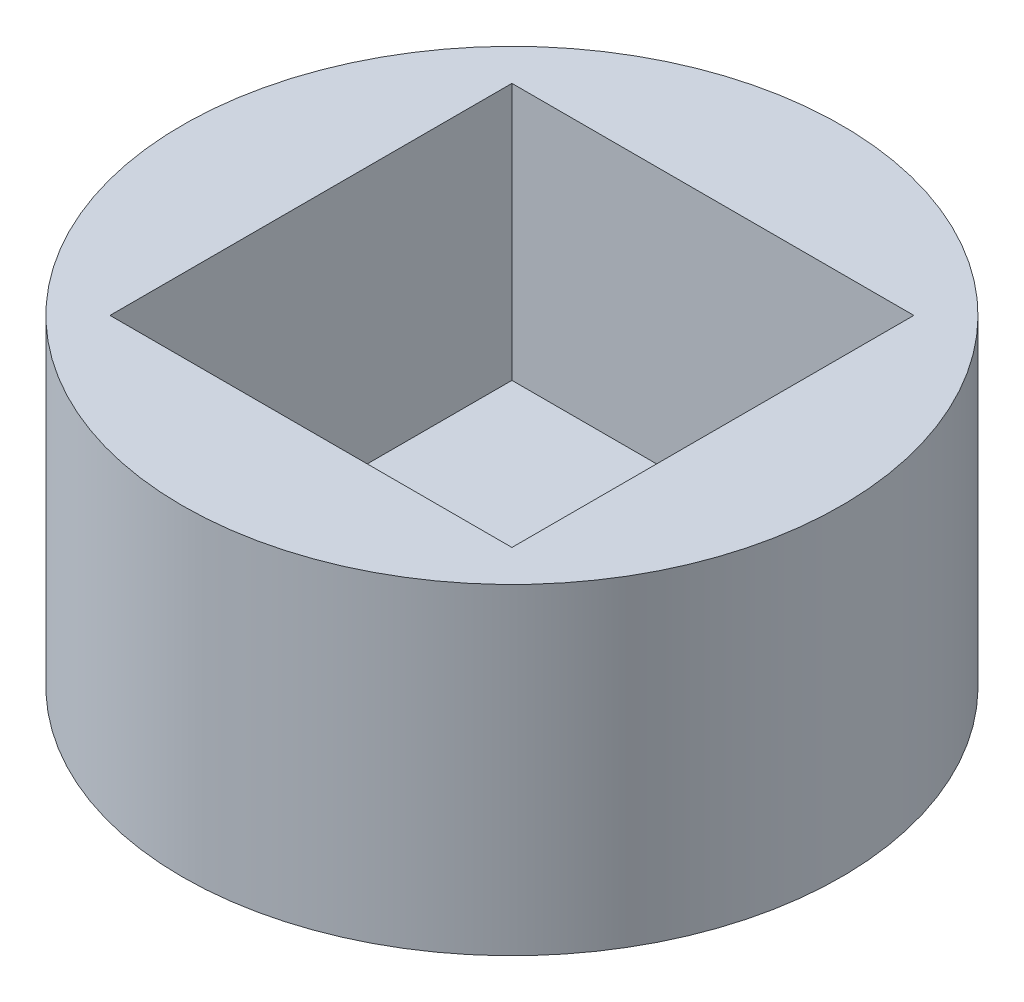
ISO-10303-21;
HEADER;
FILE_DESCRIPTION(('STEP AP214'),'2;1');
FILE_NAME('part.step','',(''),(''),'','','');
FILE_SCHEMA(('AUTOMOTIVE_DESIGN { 1 0 10303 214 1 1 1 1 }'));
ENDSEC;
DATA;
#1=APPLICATION_CONTEXT('core data for automotive mechanical design processes');
#2=APPLICATION_PROTOCOL_DEFINITION('international standard','automotive_design',2000,#1);
#3=PRODUCT_CONTEXT('',#1,'mechanical');
#4=PRODUCT('Part','Part','',(#3));
#5=PRODUCT_RELATED_PRODUCT_CATEGORY('part','',(#4));
#6=PRODUCT_DEFINITION_FORMATION('','',#4);
#7=PRODUCT_DEFINITION_CONTEXT('part definition',#1,'design');
#8=PRODUCT_DEFINITION('design','',#6,#7);
#9=PRODUCT_DEFINITION_SHAPE('','',#8);
#10=(LENGTH_UNIT() NAMED_UNIT(*) SI_UNIT(.MILLI.,.METRE.));
#11=(NAMED_UNIT(*) PLANE_ANGLE_UNIT() SI_UNIT($,.RADIAN.));
#12=(NAMED_UNIT(*) SI_UNIT($,.STERADIAN.) SOLID_ANGLE_UNIT());
#13=UNCERTAINTY_MEASURE_WITH_UNIT(LENGTH_MEASURE(1.E-05),#10,'distance_accuracy_value','');
#14=(GEOMETRIC_REPRESENTATION_CONTEXT(3) GLOBAL_UNCERTAINTY_ASSIGNED_CONTEXT((#13)) GLOBAL_UNIT_ASSIGNED_CONTEXT((#10,
#11,#12)) REPRESENTATION_CONTEXT('',''));
#15=CARTESIAN_POINT('',(0.,0.,0.));
#16=DIRECTION('',(0.,0.,1.));
#17=DIRECTION('',(1.,0.,0.));
#18=AXIS2_PLACEMENT_3D('',#15,#16,#17);
#19=CARTESIAN_POINT('',(0.,25.4,0.));
#20=DIRECTION('',(0.,-1.,0.));
#21=DIRECTION('',(0.,0.,-1.));
#22=AXIS2_PLACEMENT_3D('',#19,#20,#21);
#23=CYLINDRICAL_SURFACE('',#22,26.035);
#24=CARTESIAN_POINT('',(0.,25.4,0.));
#25=DIRECTION('',(0.,1.,0.));
#26=DIRECTION('',(0.,0.,1.));
#27=AXIS2_PLACEMENT_3D('',#24,#25,#26);
#28=CIRCLE('',#27,26.035);
#29=CARTESIAN_POINT('',(0.,25.4,26.035));
#30=VERTEX_POINT('',#29);
#31=EDGE_CURVE('E11',#30,#30,#28,.T.);
#32=ORIENTED_EDGE('',*,*,#31,.F.);
#33=EDGE_LOOP('',(#32));
#34=FACE_BOUND('',#33,.T.);
#35=CARTESIAN_POINT('',(0.,0.,0.));
#36=DIRECTION('',(0.,1.,0.));
#37=DIRECTION('',(0.,0.,1.));
#38=AXIS2_PLACEMENT_3D('',#35,#36,#37);
#39=CIRCLE('',#38,26.035);
#40=CARTESIAN_POINT('',(0.,0.,26.035));
#41=VERTEX_POINT('',#40);
#42=EDGE_CURVE('E50',#41,#41,#39,.T.);
#43=ORIENTED_EDGE('',*,*,#42,.T.);
#44=EDGE_LOOP('',(#43));
#45=FACE_BOUND('',#44,.T.);
#46=ADVANCED_FACE('F47',(#34,#45),#23,.T.);
#47=CARTESIAN_POINT('',(0.,25.4,0.));
#48=DIRECTION('',(0.,1.,0.));
#49=DIRECTION('',(0.,0.,1.));
#50=AXIS2_PLACEMENT_3D('',#47,#48,#49);
#51=PLANE('',#50);
#52=DIRECTION('',(0.,0.,-1.));
#53=VECTOR('',#52,1.);
#54=CARTESIAN_POINT('',(15.875,25.4,15.875));
#55=LINE('',#54,#53);
#56=CARTESIAN_POINT('',(15.875,25.4,15.875));
#57=VERTEX_POINT('',#56);
#58=CARTESIAN_POINT('',(15.875,25.4,-15.875));
#59=VERTEX_POINT('',#58);
#60=EDGE_CURVE('E62',#57,#59,#55,.T.);
#61=ORIENTED_EDGE('',*,*,#60,.F.);
#62=DIRECTION('',(1.,0.,0.));
#63=VECTOR('',#62,1.);
#64=CARTESIAN_POINT('',(-15.875,25.4,15.875));
#65=LINE('',#64,#63);
#66=CARTESIAN_POINT('',(-15.875,25.4,15.875));
#67=VERTEX_POINT('',#66);
#68=EDGE_CURVE('E118',#67,#57,#65,.T.);
#69=ORIENTED_EDGE('',*,*,#68,.F.);
#70=DIRECTION('',(0.,0.,1.));
#71=VECTOR('',#70,1.);
#72=CARTESIAN_POINT('',(-15.875,25.4,15.875));
#73=LINE('',#72,#71);
#74=CARTESIAN_POINT('',(-15.875,25.4,-15.875));
#75=VERTEX_POINT('',#74);
#76=EDGE_CURVE('E127',#75,#67,#73,.T.);
#77=ORIENTED_EDGE('',*,*,#76,.F.);
#78=DIRECTION('',(-1.,0.,0.));
#79=VECTOR('',#78,1.);
#80=CARTESIAN_POINT('',(-15.875,25.4,-15.875));
#81=LINE('',#80,#79);
#82=EDGE_CURVE('E97',#59,#75,#81,.T.);
#83=ORIENTED_EDGE('',*,*,#82,.F.);
#84=EDGE_LOOP('',(#61,#69,#77,#83));
#85=FACE_BOUND('',#84,.T.);
#86=ORIENTED_EDGE('',*,*,#31,.T.);
#87=EDGE_LOOP('',(#86));
#88=FACE_BOUND('',#87,.T.);
#89=ADVANCED_FACE('F139',(#85,#88),#51,.T.);
#90=CARTESIAN_POINT('',(0.,0.,0.));
#91=DIRECTION('',(0.,1.,0.));
#92=DIRECTION('',(0.,0.,1.));
#93=AXIS2_PLACEMENT_3D('',#90,#91,#92);
#94=PLANE('',#93);
#95=ORIENTED_EDGE('',*,*,#42,.F.);
#96=EDGE_LOOP('',(#95));
#97=FACE_BOUND('',#96,.T.);
#98=ADVANCED_FACE('F152',(#97),#94,.F.);
#99=CARTESIAN_POINT('',(15.875,5.07999999999997,15.875));
#100=DIRECTION('',(1.,0.,0.));
#101=DIRECTION('',(0.,0.,-1.));
#102=AXIS2_PLACEMENT_3D('',#99,#100,#101);
#103=PLANE('',#102);
#104=ORIENTED_EDGE('',*,*,#60,.T.);
#105=DIRECTION('',(0.,1.,0.));
#106=VECTOR('',#105,1.);
#107=CARTESIAN_POINT('',(15.875,5.07999999999997,-15.875));
#108=LINE('',#107,#106);
#109=CARTESIAN_POINT('',(15.875,5.07999999999997,-15.875));
#110=VERTEX_POINT('',#109);
#111=EDGE_CURVE('E85',#110,#59,#108,.T.);
#112=ORIENTED_EDGE('',*,*,#111,.F.);
#113=DIRECTION('',(0.,0.,-1.));
#114=VECTOR('',#113,1.);
#115=CARTESIAN_POINT('',(15.875,5.07999999999997,15.875));
#116=LINE('',#115,#114);
#117=CARTESIAN_POINT('',(15.875,5.07999999999997,15.875));
#118=VERTEX_POINT('',#117);
#119=EDGE_CURVE('E113',#118,#110,#116,.T.);
#120=ORIENTED_EDGE('',*,*,#119,.F.);
#121=DIRECTION('',(0.,1.,0.));
#122=VECTOR('',#121,1.);
#123=CARTESIAN_POINT('',(15.875,5.07999999999997,15.875));
#124=LINE('',#123,#122);
#125=EDGE_CURVE('E70',#118,#57,#124,.T.);
#126=ORIENTED_EDGE('',*,*,#125,.T.);
#127=EDGE_LOOP('',(#104,#112,#120,#126));
#128=FACE_BOUND('',#127,.T.);
#129=ADVANCED_FACE('F144',(#128),#103,.F.);
#130=CARTESIAN_POINT('',(-15.875,5.08000000000003,15.875));
#131=DIRECTION('',(0.,0.,1.));
#132=DIRECTION('',(1.,0.,0.));
#133=AXIS2_PLACEMENT_3D('',#130,#131,#132);
#134=PLANE('',#133);
#135=ORIENTED_EDGE('',*,*,#68,.T.);
#136=ORIENTED_EDGE('',*,*,#125,.F.);
#137=DIRECTION('',(1.,0.,0.));
#138=VECTOR('',#137,1.);
#139=CARTESIAN_POINT('',(-15.875,5.08000000000003,15.875));
#140=LINE('',#139,#138);
#141=CARTESIAN_POINT('',(-15.875,5.08000000000003,15.875));
#142=VERTEX_POINT('',#141);
#143=EDGE_CURVE('E110',#142,#118,#140,.T.);
#144=ORIENTED_EDGE('',*,*,#143,.F.);
#145=DIRECTION('',(0.,1.,0.));
#146=VECTOR('',#145,1.);
#147=CARTESIAN_POINT('',(-15.875,5.08000000000003,15.875));
#148=LINE('',#147,#146);
#149=EDGE_CURVE('E102',#142,#67,#148,.T.);
#150=ORIENTED_EDGE('',*,*,#149,.T.);
#151=EDGE_LOOP('',(#135,#136,#144,#150));
#152=FACE_BOUND('',#151,.T.);
#153=ADVANCED_FACE('F142',(#152),#134,.F.);
#154=CARTESIAN_POINT('',(-15.875,5.08000000000003,15.875));
#155=DIRECTION('',(-1.,0.,0.));
#156=DIRECTION('',(0.,0.,1.));
#157=AXIS2_PLACEMENT_3D('',#154,#155,#156);
#158=PLANE('',#157);
#159=ORIENTED_EDGE('',*,*,#76,.T.);
#160=ORIENTED_EDGE('',*,*,#149,.F.);
#161=DIRECTION('',(0.,0.,1.));
#162=VECTOR('',#161,1.);
#163=CARTESIAN_POINT('',(-15.875,5.08000000000003,15.875));
#164=LINE('',#163,#162);
#165=CARTESIAN_POINT('',(-15.875,5.08000000000003,-15.875));
#166=VERTEX_POINT('',#165);
#167=EDGE_CURVE('E105',#166,#142,#164,.T.);
#168=ORIENTED_EDGE('',*,*,#167,.F.);
#169=DIRECTION('',(0.,1.,0.));
#170=VECTOR('',#169,1.);
#171=CARTESIAN_POINT('',(-15.875,5.08000000000003,-15.875));
#172=LINE('',#171,#170);
#173=EDGE_CURVE('E90',#166,#75,#172,.T.);
#174=ORIENTED_EDGE('',*,*,#173,.T.);
#175=EDGE_LOOP('',(#159,#160,#168,#174));
#176=FACE_BOUND('',#175,.T.);
#177=ADVANCED_FACE('F106',(#176),#158,.F.);
#178=CARTESIAN_POINT('',(-15.875,5.08000000000003,-15.875));
#179=DIRECTION('',(0.,0.,-1.));
#180=DIRECTION('',(-1.,0.,0.));
#181=AXIS2_PLACEMENT_3D('',#178,#179,#180);
#182=PLANE('',#181);
#183=ORIENTED_EDGE('',*,*,#82,.T.);
#184=ORIENTED_EDGE('',*,*,#173,.F.);
#185=DIRECTION('',(-1.,0.,0.));
#186=VECTOR('',#185,1.);
#187=CARTESIAN_POINT('',(-15.875,5.08000000000003,-15.875));
#188=LINE('',#187,#186);
#189=EDGE_CURVE('E94',#110,#166,#188,.T.);
#190=ORIENTED_EDGE('',*,*,#189,.F.);
#191=ORIENTED_EDGE('',*,*,#111,.T.);
#192=EDGE_LOOP('',(#183,#184,#190,#191));
#193=FACE_BOUND('',#192,.T.);
#194=ADVANCED_FACE('F92',(#193),#182,.F.);
#195=CARTESIAN_POINT('',(0.,5.07999999999997,0.));
#196=DIRECTION('',(0.,-1.,0.));
#197=DIRECTION('',(0.,0.,-1.));
#198=AXIS2_PLACEMENT_3D('',#195,#196,#197);
#199=PLANE('',#198);
#200=ORIENTED_EDGE('',*,*,#119,.T.);
#201=ORIENTED_EDGE('',*,*,#189,.T.);
#202=ORIENTED_EDGE('',*,*,#167,.T.);
#203=ORIENTED_EDGE('',*,*,#143,.T.);
#204=EDGE_LOOP('',(#200,#201,#202,#203));
#205=FACE_BOUND('',#204,.T.);
#206=ADVANCED_FACE('F112',(#205),#199,.F.);
#207=CLOSED_SHELL('',(#46,#89,#98,#129,#153,#177,#194,#206));
#208=MANIFOLD_SOLID_BREP('B2',#207);
#209=ADVANCED_BREP_SHAPE_REPRESENTATION('',(#18,#208),#14);
#210=SHAPE_DEFINITION_REPRESENTATION(#9,#209);
ENDSEC;
END-ISO-10303-21;
